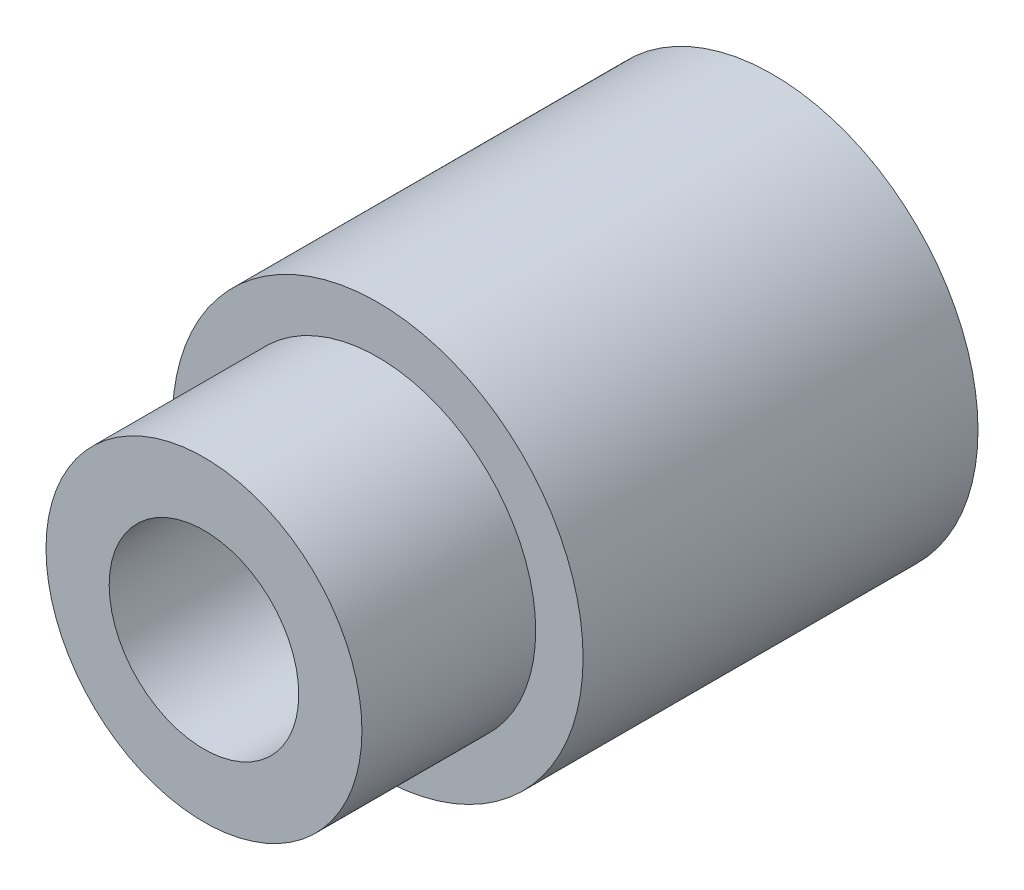
ISO-10303-21;
HEADER;
FILE_DESCRIPTION(('STEP AP214'),'2;1');
FILE_NAME('part.step','',(''),(''),'','','');
FILE_SCHEMA(('AUTOMOTIVE_DESIGN { 1 0 10303 214 1 1 1 1 }'));
ENDSEC;
DATA;
#1=APPLICATION_CONTEXT('core data for automotive mechanical design processes');
#2=APPLICATION_PROTOCOL_DEFINITION('international standard','automotive_design',2000,#1);
#3=PRODUCT_CONTEXT('',#1,'mechanical');
#4=PRODUCT('Part','Part','',(#3));
#5=PRODUCT_RELATED_PRODUCT_CATEGORY('part','',(#4));
#6=PRODUCT_DEFINITION_FORMATION('','',#4);
#7=PRODUCT_DEFINITION_CONTEXT('part definition',#1,'design');
#8=PRODUCT_DEFINITION('design','',#6,#7);
#9=PRODUCT_DEFINITION_SHAPE('','',#8);
#10=(LENGTH_UNIT() NAMED_UNIT(*) SI_UNIT(.MILLI.,.METRE.));
#11=(NAMED_UNIT(*) PLANE_ANGLE_UNIT() SI_UNIT($,.RADIAN.));
#12=(NAMED_UNIT(*) SI_UNIT($,.STERADIAN.) SOLID_ANGLE_UNIT());
#13=UNCERTAINTY_MEASURE_WITH_UNIT(LENGTH_MEASURE(1.E-05),#10,'distance_accuracy_value','');
#14=(GEOMETRIC_REPRESENTATION_CONTEXT(3) GLOBAL_UNCERTAINTY_ASSIGNED_CONTEXT((#13)) GLOBAL_UNIT_ASSIGNED_CONTEXT((#10,
#11,#12)) REPRESENTATION_CONTEXT('',''));
#15=CARTESIAN_POINT('',(0.,0.,0.));
#16=DIRECTION('',(0.,0.,1.));
#17=DIRECTION('',(1.,0.,0.));
#18=AXIS2_PLACEMENT_3D('',#15,#16,#17);
#19=CARTESIAN_POINT('',(0.,0.,-25.));
#20=DIRECTION('',(0.,0.,1.));
#21=DIRECTION('',(1.,0.,0.));
#22=AXIS2_PLACEMENT_3D('',#19,#20,#21);
#23=CYLINDRICAL_SURFACE('',#22,6.);
#24=CARTESIAN_POINT('',(0.,0.,-25.));
#25=DIRECTION('',(0.,0.,1.));
#26=DIRECTION('',(1.,0.,0.));
#27=AXIS2_PLACEMENT_3D('',#24,#25,#26);
#28=CIRCLE('',#27,6.);
#29=CARTESIAN_POINT('',(6.,0.,-25.));
#30=VERTEX_POINT('',#29);
#31=EDGE_CURVE('E46',#30,#30,#28,.T.);
#32=ORIENTED_EDGE('',*,*,#31,.F.);
#33=EDGE_LOOP('',(#32));
#34=FACE_BOUND('',#33,.T.);
#35=CARTESIAN_POINT('',(0.,0.,11.));
#36=DIRECTION('',(0.,0.,1.));
#37=DIRECTION('',(1.,0.,0.));
#38=AXIS2_PLACEMENT_3D('',#35,#36,#37);
#39=CIRCLE('',#38,6.);
#40=CARTESIAN_POINT('',(6.,0.,11.));
#41=VERTEX_POINT('',#40);
#42=EDGE_CURVE('E41',#41,#41,#39,.F.);
#43=ORIENTED_EDGE('',*,*,#42,.F.);
#44=EDGE_LOOP('',(#43));
#45=FACE_BOUND('',#44,.T.);
#46=ADVANCED_FACE('F14',(#34,#45),#23,.F.);
#47=CARTESIAN_POINT('',(13.,-13.,-25.));
#48=DIRECTION('',(0.,0.,-1.));
#49=DIRECTION('',(-1.,0.,0.));
#50=AXIS2_PLACEMENT_3D('',#47,#48,#49);
#51=PLANE('',#50);
#52=ORIENTED_EDGE('',*,*,#31,.T.);
#53=EDGE_LOOP('',(#52));
#54=FACE_BOUND('',#53,.T.);
#55=CARTESIAN_POINT('',(0.,0.,-25.));
#56=DIRECTION('',(0.,0.,1.));
#57=DIRECTION('',(1.,0.,0.));
#58=AXIS2_PLACEMENT_3D('',#55,#56,#57);
#59=CIRCLE('',#58,13.);
#60=CARTESIAN_POINT('',(13.,0.,-25.));
#61=VERTEX_POINT('',#60);
#62=EDGE_CURVE('E36',#61,#61,#59,.F.);
#63=ORIENTED_EDGE('',*,*,#62,.T.);
#64=EDGE_LOOP('',(#63));
#65=FACE_BOUND('',#64,.T.);
#66=ADVANCED_FACE('F51',(#54,#65),#51,.T.);
#67=CARTESIAN_POINT('',(-10.,-10.,11.));
#68=DIRECTION('',(0.,0.,1.));
#69=DIRECTION('',(1.,0.,0.));
#70=AXIS2_PLACEMENT_3D('',#67,#68,#69);
#71=PLANE('',#70);
#72=ORIENTED_EDGE('',*,*,#42,.T.);
#73=EDGE_LOOP('',(#72));
#74=FACE_BOUND('',#73,.T.);
#75=CARTESIAN_POINT('',(0.,0.,11.));
#76=DIRECTION('',(0.,0.,1.));
#77=DIRECTION('',(1.,0.,0.));
#78=AXIS2_PLACEMENT_3D('',#75,#76,#77);
#79=CIRCLE('',#78,10.);
#80=CARTESIAN_POINT('',(10.,0.,11.));
#81=VERTEX_POINT('',#80);
#82=EDGE_CURVE('E27',#81,#81,#79,.T.);
#83=ORIENTED_EDGE('',*,*,#82,.T.);
#84=EDGE_LOOP('',(#83));
#85=FACE_BOUND('',#84,.T.);
#86=ADVANCED_FACE('F59',(#74,#85),#71,.T.);
#87=CARTESIAN_POINT('',(0.,0.,-25.));
#88=DIRECTION('',(0.,0.,1.));
#89=DIRECTION('',(1.,0.,0.));
#90=AXIS2_PLACEMENT_3D('',#87,#88,#89);
#91=CYLINDRICAL_SURFACE('',#90,13.);
#92=ORIENTED_EDGE('',*,*,#62,.F.);
#93=EDGE_LOOP('',(#92));
#94=FACE_BOUND('',#93,.T.);
#95=CARTESIAN_POINT('',(0.,0.,0.));
#96=DIRECTION('',(0.,0.,1.));
#97=DIRECTION('',(1.,0.,0.));
#98=AXIS2_PLACEMENT_3D('',#95,#96,#97);
#99=CIRCLE('',#98,13.);
#100=CARTESIAN_POINT('',(13.,0.,0.));
#101=VERTEX_POINT('',#100);
#102=EDGE_CURVE('E22',#101,#101,#99,.T.);
#103=ORIENTED_EDGE('',*,*,#102,.F.);
#104=EDGE_LOOP('',(#103));
#105=FACE_BOUND('',#104,.T.);
#106=ADVANCED_FACE('F62',(#94,#105),#91,.T.);
#107=CARTESIAN_POINT('',(0.,0.,0.));
#108=DIRECTION('',(0.,0.,1.));
#109=DIRECTION('',(1.,0.,0.));
#110=AXIS2_PLACEMENT_3D('',#107,#108,#109);
#111=CYLINDRICAL_SURFACE('',#110,10.);
#112=CARTESIAN_POINT('',(0.,0.,0.));
#113=DIRECTION('',(0.,0.,1.));
#114=DIRECTION('',(1.,0.,0.));
#115=AXIS2_PLACEMENT_3D('',#112,#113,#114);
#116=CIRCLE('',#115,10.);
#117=CARTESIAN_POINT('',(10.,0.,0.));
#118=VERTEX_POINT('',#117);
#119=EDGE_CURVE('E9',#118,#118,#116,.F.);
#120=ORIENTED_EDGE('',*,*,#119,.F.);
#121=EDGE_LOOP('',(#120));
#122=FACE_BOUND('',#121,.T.);
#123=ORIENTED_EDGE('',*,*,#82,.F.);
#124=EDGE_LOOP('',(#123));
#125=FACE_BOUND('',#124,.T.);
#126=ADVANCED_FACE('F65',(#122,#125),#111,.T.);
#127=CARTESIAN_POINT('',(-13.,-13.,0.));
#128=DIRECTION('',(0.,0.,1.));
#129=DIRECTION('',(1.,0.,0.));
#130=AXIS2_PLACEMENT_3D('',#127,#128,#129);
#131=PLANE('',#130);
#132=ORIENTED_EDGE('',*,*,#119,.T.);
#133=EDGE_LOOP('',(#132));
#134=FACE_BOUND('',#133,.T.);
#135=ORIENTED_EDGE('',*,*,#102,.T.);
#136=EDGE_LOOP('',(#135));
#137=FACE_BOUND('',#136,.T.);
#138=ADVANCED_FACE('F16',(#134,#137),#131,.T.);
#139=CLOSED_SHELL('',(#46,#66,#86,#106,#126,#138));
#140=MANIFOLD_SOLID_BREP('B1',#139);
#141=ADVANCED_BREP_SHAPE_REPRESENTATION('',(#18,#140),#14);
#142=SHAPE_DEFINITION_REPRESENTATION(#9,#141);
ENDSEC;
END-ISO-10303-21;
